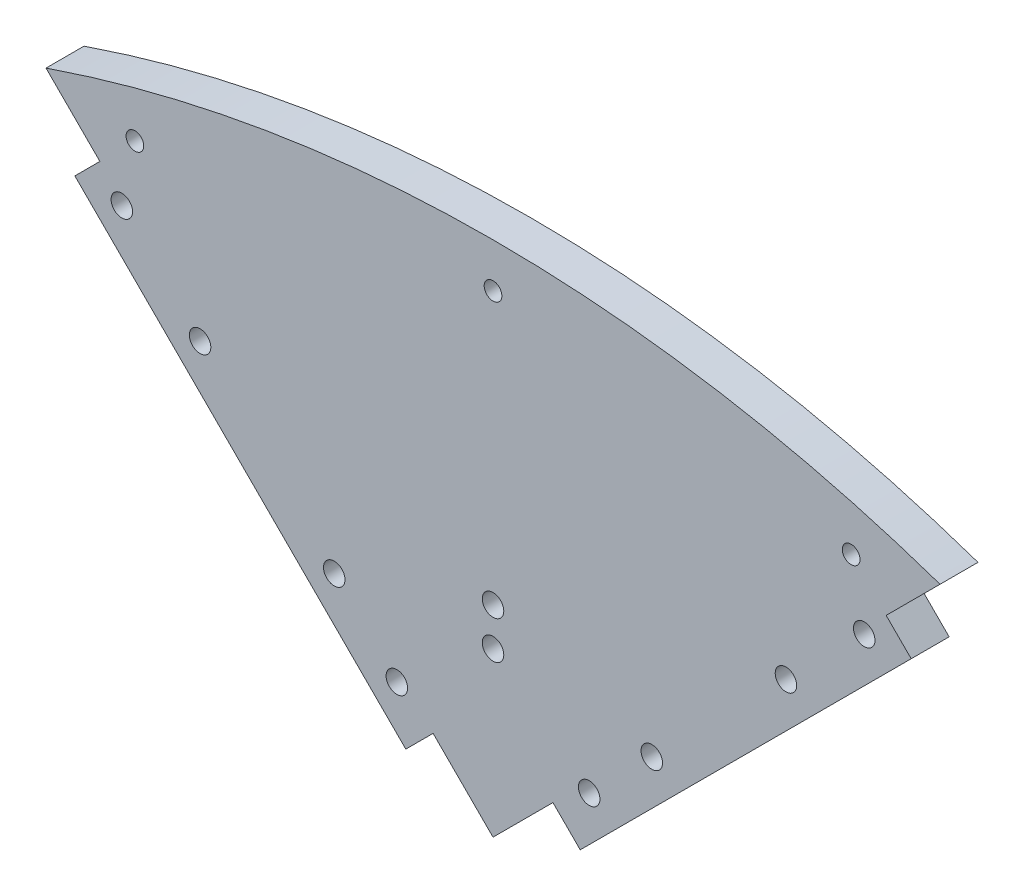
ISO-10303-21;
HEADER;
FILE_DESCRIPTION(('STEP AP214'),'2;1');
FILE_NAME('part.step','',(''),(''),'','','');
FILE_SCHEMA(('AUTOMOTIVE_DESIGN { 1 0 10303 214 1 1 1 1 }'));
ENDSEC;
DATA;
#1=APPLICATION_CONTEXT('core data for automotive mechanical design processes');
#2=APPLICATION_PROTOCOL_DEFINITION('international standard','automotive_design',2000,#1);
#3=PRODUCT_CONTEXT('',#1,'mechanical');
#4=PRODUCT('Part','Part','',(#3));
#5=PRODUCT_RELATED_PRODUCT_CATEGORY('part','',(#4));
#6=PRODUCT_DEFINITION_FORMATION('','',#4);
#7=PRODUCT_DEFINITION_CONTEXT('part definition',#1,'design');
#8=PRODUCT_DEFINITION('design','',#6,#7);
#9=PRODUCT_DEFINITION_SHAPE('','',#8);
#10=(LENGTH_UNIT() NAMED_UNIT(*) SI_UNIT(.MILLI.,.METRE.));
#11=(NAMED_UNIT(*) PLANE_ANGLE_UNIT() SI_UNIT($,.RADIAN.));
#12=(NAMED_UNIT(*) SI_UNIT($,.STERADIAN.) SOLID_ANGLE_UNIT());
#13=UNCERTAINTY_MEASURE_WITH_UNIT(LENGTH_MEASURE(1.E-05),#10,'distance_accuracy_value','');
#14=(GEOMETRIC_REPRESENTATION_CONTEXT(3) GLOBAL_UNCERTAINTY_ASSIGNED_CONTEXT((#13)) GLOBAL_UNIT_ASSIGNED_CONTEXT((#10,
#11,#12)) REPRESENTATION_CONTEXT('',''));
#15=CARTESIAN_POINT('',(0.,0.,0.));
#16=DIRECTION('',(0.,0.,1.));
#17=DIRECTION('',(1.,0.,0.));
#18=AXIS2_PLACEMENT_3D('',#15,#16,#17);
#19=CARTESIAN_POINT('',(0.,0.,67.));
#20=DIRECTION('',(0.,0.,1.));
#21=DIRECTION('',(1.,0.,0.));
#22=AXIS2_PLACEMENT_3D('',#19,#20,#21);
#23=PLANE('',#22);
#24=CARTESIAN_POINT('',(56.620161762074,202.22303845515,67.));
#25=DIRECTION('',(0.,0.,1.));
#26=DIRECTION('',(1.,0.,0.));
#27=AXIS2_PLACEMENT_3D('',#24,#25,#26);
#28=CIRCLE('',#27,1.4);
#29=CARTESIAN_POINT('',(58.020161762074,202.22303845515,67.));
#30=VERTEX_POINT('',#29);
#31=EDGE_CURVE('E9',#30,#30,#28,.T.);
#32=ORIENTED_EDGE('',*,*,#31,.T.);
#33=EDGE_LOOP('',(#32));
#34=FACE_BOUND('',#33,.T.);
#35=CARTESIAN_POINT('',(58.689862838483,192.33304448274,67.));
#36=DIRECTION('',(0.,0.,1.));
#37=DIRECTION('',(-0.707106781186548,-0.707106781186548,0.));
#38=AXIS2_PLACEMENT_3D('',#35,#36,#37);
#39=CIRCLE('',#38,1.7);
#40=CARTESIAN_POINT('',(57.487781310466,191.13096295472,67.));
#41=VERTEX_POINT('',#40);
#42=EDGE_CURVE('E259',#41,#41,#39,.T.);
#43=ORIENTED_EDGE('',*,*,#42,.T.);
#44=EDGE_LOOP('',(#43));
#45=FACE_BOUND('',#44,.T.);
#46=CARTESIAN_POINT('',(46.315494167719,179.95867581197,67.));
#47=DIRECTION('',(0.,0.,1.));
#48=DIRECTION('',(-0.707106781186548,-0.707106781186548,0.));
#49=AXIS2_PLACEMENT_3D('',#46,#47,#48);
#50=CIRCLE('',#49,1.7);
#51=CARTESIAN_POINT('',(45.113412639702,178.75659428395,67.));
#52=VERTEX_POINT('',#51);
#53=EDGE_CURVE('E194',#52,#52,#50,.T.);
#54=ORIENTED_EDGE('',*,*,#53,.T.);
#55=EDGE_LOOP('',(#54));
#56=FACE_BOUND('',#55,.T.);
#57=CARTESIAN_POINT('',(0.,210.,67.));
#58=DIRECTION('',(0.,0.,1.));
#59=DIRECTION('',(1.,0.,0.));
#60=AXIS2_PLACEMENT_3D('',#57,#58,#59);
#61=CIRCLE('',#60,1.4);
#62=CARTESIAN_POINT('',(1.4,210.,67.));
#63=VERTEX_POINT('',#62);
#64=EDGE_CURVE('E180',#63,#63,#61,.T.);
#65=ORIENTED_EDGE('',*,*,#64,.T.);
#66=EDGE_LOOP('',(#65));
#67=FACE_BOUND('',#66,.T.);
#68=CARTESIAN_POINT('',(-56.62016176207,202.22303845515,67.));
#69=DIRECTION('',(0.,0.,1.));
#70=DIRECTION('',(1.,0.,0.));
#71=AXIS2_PLACEMENT_3D('',#68,#69,#70);
#72=CIRCLE('',#71,1.4);
#73=CARTESIAN_POINT('',(-55.22016176207,202.22303845515,67.));
#74=VERTEX_POINT('',#73);
#75=EDGE_CURVE('E196',#74,#74,#72,.T.);
#76=ORIENTED_EDGE('',*,*,#75,.T.);
#77=EDGE_LOOP('',(#76));
#78=FACE_BOUND('',#77,.T.);
#79=CARTESIAN_POINT('',(-58.68986283848,192.33304448274,67.));
#80=DIRECTION('',(0.,0.,1.));
#81=DIRECTION('',(0.707106781186548,-0.707106781186548,0.));
#82=AXIS2_PLACEMENT_3D('',#79,#80,#81);
#83=CIRCLE('',#82,1.7);
#84=CARTESIAN_POINT('',(-57.48778131046,191.13096295472,67.));
#85=VERTEX_POINT('',#84);
#86=EDGE_CURVE('E205',#85,#85,#83,.T.);
#87=ORIENTED_EDGE('',*,*,#86,.T.);
#88=EDGE_LOOP('',(#87));
#89=FACE_BOUND('',#88,.T.);
#90=CARTESIAN_POINT('',(-46.31549416771,179.95867581197,67.));
#91=DIRECTION('',(0.,0.,1.));
#92=DIRECTION('',(0.707106781186548,-0.707106781186548,0.));
#93=AXIS2_PLACEMENT_3D('',#90,#91,#92);
#94=CIRCLE('',#93,1.7);
#95=CARTESIAN_POINT('',(-45.1134126397,178.75659428395,67.));
#96=VERTEX_POINT('',#95);
#97=EDGE_CURVE('E275',#96,#96,#94,.T.);
#98=ORIENTED_EDGE('',*,*,#97,.T.);
#99=EDGE_LOOP('',(#98));
#100=FACE_BOUND('',#99,.T.);
#101=CARTESIAN_POINT('',(25.102290732122,158.74547237638,67.));
#102=DIRECTION('',(0.,0.,1.));
#103=DIRECTION('',(-0.707106781186548,-0.707106781186548,0.));
#104=AXIS2_PLACEMENT_3D('',#101,#102,#103);
#105=CIRCLE('',#104,1.7);
#106=CARTESIAN_POINT('',(23.900209204105,157.54339084836,67.));
#107=VERTEX_POINT('',#106);
#108=EDGE_CURVE('E232',#107,#107,#105,.T.);
#109=ORIENTED_EDGE('',*,*,#108,.T.);
#110=EDGE_LOOP('',(#109));
#111=FACE_BOUND('',#110,.T.);
#112=CARTESIAN_POINT('',(15.202795795511,148.84597743976,67.));
#113=DIRECTION('',(0.,0.,1.));
#114=DIRECTION('',(-0.707106781186548,-0.707106781186548,0.));
#115=AXIS2_PLACEMENT_3D('',#112,#113,#114);
#116=CIRCLE('',#115,1.7);
#117=CARTESIAN_POINT('',(14.000714267494,147.64389591175,67.));
#118=VERTEX_POINT('',#117);
#119=EDGE_CURVE('E233',#118,#118,#116,.T.);
#120=ORIENTED_EDGE('',*,*,#119,.T.);
#121=EDGE_LOOP('',(#120));
#122=FACE_BOUND('',#121,.T.);
#123=CARTESIAN_POINT('',(0.,167.,67.));
#124=DIRECTION('',(0.,0.,1.));
#125=DIRECTION('',(1.,0.,0.));
#126=AXIS2_PLACEMENT_3D('',#123,#124,#125);
#127=CIRCLE('',#126,1.7);
#128=CARTESIAN_POINT('',(1.7,167.,67.));
#129=VERTEX_POINT('',#128);
#130=EDGE_CURVE('E341',#129,#129,#127,.T.);
#131=ORIENTED_EDGE('',*,*,#130,.T.);
#132=EDGE_LOOP('',(#131));
#133=FACE_BOUND('',#132,.T.);
#134=CARTESIAN_POINT('',(0.,161.,67.));
#135=DIRECTION('',(0.,0.,1.));
#136=DIRECTION('',(1.,0.,0.));
#137=AXIS2_PLACEMENT_3D('',#134,#135,#136);
#138=CIRCLE('',#137,1.7);
#139=CARTESIAN_POINT('',(1.7,161.,67.));
#140=VERTEX_POINT('',#139);
#141=EDGE_CURVE('E372',#140,#140,#138,.T.);
#142=ORIENTED_EDGE('',*,*,#141,.T.);
#143=EDGE_LOOP('',(#142));
#144=FACE_BOUND('',#143,.T.);
#145=CARTESIAN_POINT('',(-25.10229073212,158.74547237638,67.));
#146=DIRECTION('',(0.,0.,1.));
#147=DIRECTION('',(0.707106781186548,-0.707106781186548,0.));
#148=AXIS2_PLACEMENT_3D('',#145,#146,#147);
#149=CIRCLE('',#148,1.7);
#150=CARTESIAN_POINT('',(-23.9002092041,157.54339084836,67.));
#151=VERTEX_POINT('',#150);
#152=EDGE_CURVE('E306',#151,#151,#149,.T.);
#153=ORIENTED_EDGE('',*,*,#152,.T.);
#154=EDGE_LOOP('',(#153));
#155=FACE_BOUND('',#154,.T.);
#156=CARTESIAN_POINT('',(-15.20279579551,148.84597743976,67.));
#157=DIRECTION('',(0.,0.,1.));
#158=DIRECTION('',(0.707106781186548,-0.707106781186548,0.));
#159=AXIS2_PLACEMENT_3D('',#156,#157,#158);
#160=CIRCLE('',#159,1.7);
#161=CARTESIAN_POINT('',(-14.00071426749,147.64389591175,67.));
#162=VERTEX_POINT('',#161);
#163=EDGE_CURVE('E360',#162,#162,#160,.T.);
#164=ORIENTED_EDGE('',*,*,#163,.T.);
#165=EDGE_LOOP('',(#164));
#166=FACE_BOUND('',#165,.T.);
#167=DIRECTION('',(0.707106781186548,0.707106781186548,0.));
#168=VECTOR('',#167,1.);
#169=CARTESIAN_POINT('',(1.803122292026,136.2948320737,67.));
#170=LINE('',#169,#168);
#171=CARTESIAN_POINT('',(62.154686066298,196.64639584797,67.));
#172=VERTEX_POINT('',#171);
#173=CARTESIAN_POINT('',(70.676206433662,205.16791621534,67.));
#174=VERTEX_POINT('',#173);
#175=EDGE_CURVE('E269',#172,#174,#170,.T.);
#176=ORIENTED_EDGE('',*,*,#175,.F.);
#177=DIRECTION('',(0.707106781186548,-0.707106781186548,0.));
#178=VECTOR('',#177,1.);
#179=CARTESIAN_POINT('',(95.777613511718,163.02346840255,67.));
#180=LINE('',#179,#178);
#181=CARTESIAN_POINT('',(66.114484040942,192.68659787333,67.));
#182=VERTEX_POINT('',#181);
#183=EDGE_CURVE('E220',#172,#182,#180,.T.);
#184=ORIENTED_EDGE('',*,*,#183,.T.);
#185=DIRECTION('',(0.707106781186548,0.707106781186548,0.));
#186=VECTOR('',#185,1.);
#187=CARTESIAN_POINT('',(1.414213562373,127.98632739476,67.));
#188=LINE('',#187,#186);
#189=CARTESIAN_POINT('',(13.788582233138,140.36069606553,67.));
#190=VERTEX_POINT('',#189);
#191=EDGE_CURVE('E208',#190,#182,#188,.T.);
#192=ORIENTED_EDGE('',*,*,#191,.F.);
#193=DIRECTION('',(0.707106781186548,-0.707106781186548,0.));
#194=VECTOR('',#193,1.);
#195=CARTESIAN_POINT('',(43.274935008617,110.87434329005,67.));
#196=LINE('',#195,#194);
#197=CARTESIAN_POINT('',(9.4752308679,144.67404743076,67.));
#198=VERTEX_POINT('',#197);
#199=EDGE_CURVE('E165',#198,#190,#196,.T.);
#200=ORIENTED_EDGE('',*,*,#199,.F.);
#201=DIRECTION('',(0.707106781186548,0.707106781186548,0.));
#202=VECTOR('',#201,1.);
#203=CARTESIAN_POINT('',(-29.06208870676,106.1367278561,67.));
#204=LINE('',#203,#202);
#205=CARTESIAN_POINT('',(0.,135.19881656286,67.));
#206=VERTEX_POINT('',#205);
#207=EDGE_CURVE('E249',#206,#198,#204,.T.);
#208=ORIENTED_EDGE('',*,*,#207,.F.);
#209=DIRECTION('',(-0.707106781186548,0.707106781186548,0.));
#210=VECTOR('',#209,1.);
#211=CARTESIAN_POINT('',(29.062088706767,106.1367278561,67.));
#212=LINE('',#211,#210);
#213=CARTESIAN_POINT('',(-9.4752308679,144.67404743076,67.));
#214=VERTEX_POINT('',#213);
#215=EDGE_CURVE('E399',#206,#214,#212,.T.);
#216=ORIENTED_EDGE('',*,*,#215,.T.);
#217=DIRECTION('',(0.707106781186548,0.707106781186548,0.));
#218=VECTOR('',#217,1.);
#219=CARTESIAN_POINT('',(-53.74011537017,100.40916292849,67.));
#220=LINE('',#219,#218);
#221=CARTESIAN_POINT('',(-13.78858223313,140.36069606553,67.));
#222=VERTEX_POINT('',#221);
#223=EDGE_CURVE('E270',#222,#214,#220,.T.);
#224=ORIENTED_EDGE('',*,*,#223,.F.);
#225=DIRECTION('',(-0.707106781186548,0.707106781186548,0.));
#226=VECTOR('',#225,1.);
#227=CARTESIAN_POINT('',(-1.414213562373,127.98632739476,67.));
#228=LINE('',#227,#226);
#229=CARTESIAN_POINT('',(-66.11448404094,192.68659787333,67.));
#230=VERTEX_POINT('',#229);
#231=EDGE_CURVE('E150',#222,#230,#228,.T.);
#232=ORIENTED_EDGE('',*,*,#231,.T.);
#233=DIRECTION('',(0.707106781186548,0.707106781186548,0.));
#234=VECTOR('',#233,1.);
#235=CARTESIAN_POINT('',(-101.4698231002,157.331258814,67.));
#236=LINE('',#235,#234);
#237=CARTESIAN_POINT('',(-62.15468606629,196.64639584797,67.));
#238=VERTEX_POINT('',#237);
#239=EDGE_CURVE('E216',#230,#238,#236,.T.);
#240=ORIENTED_EDGE('',*,*,#239,.T.);
#241=DIRECTION('',(-0.707106781186548,0.707106781186548,0.));
#242=VECTOR('',#241,1.);
#243=CARTESIAN_POINT('',(-1.803122292026,136.2948320737,67.));
#244=LINE('',#243,#242);
#245=CARTESIAN_POINT('',(-70.67620643366,205.16791621534,67.));
#246=VERTEX_POINT('',#245);
#247=EDGE_CURVE('E237',#238,#246,#244,.T.);
#248=ORIENTED_EDGE('',*,*,#247,.T.);
#249=CARTESIAN_POINT('',(0.,0.,67.));
#250=DIRECTION('',(0.,0.,-1.));
#251=DIRECTION('',(-0.959406277217956,0.282027649769987,0.));
#252=AXIS2_PLACEMENT_3D('',#249,#250,#251);
#253=CIRCLE('',#252,217.);
#254=EDGE_CURVE('E298',#246,#174,#253,.T.);
#255=ORIENTED_EDGE('',*,*,#254,.T.);
#256=EDGE_LOOP('',(#176,#184,#192,#200,#208,#216,#224,#232,#240,#248,#255));
#257=FACE_BOUND('',#256,.T.);
#258=ADVANCED_FACE('F14',(#34,#45,#56,#67,#78,#89,#100,#111,#122,#133,#144,#155,#166,#257),#23,.F.);
#259=CARTESIAN_POINT('',(56.620161762074,202.22303845515,66.89));
#260=DIRECTION('',(0.,0.,1.));
#261=DIRECTION('',(1.,0.,0.));
#262=AXIS2_PLACEMENT_3D('',#259,#260,#261);
#263=CYLINDRICAL_SURFACE('',#262,1.4);
#264=DIRECTION('',(0.,0.,1.));
#265=VECTOR('',#264,1.);
#266=CARTESIAN_POINT('',(58.020161762074,202.22303845515,66.89));
#267=LINE('',#266,#265);
#268=CARTESIAN_POINT('',(58.020161762074,202.22303845515,73.));
#269=VERTEX_POINT('',#268);
#270=EDGE_CURVE('E25',#30,#269,#267,.T.);
#271=ORIENTED_EDGE('',*,*,#270,.F.);
#272=ORIENTED_EDGE('',*,*,#31,.F.);
#273=ORIENTED_EDGE('',*,*,#270,.T.);
#274=CARTESIAN_POINT('',(56.620161762074,202.22303845515,73.));
#275=DIRECTION('',(0.,0.,1.));
#276=DIRECTION('',(1.,0.,0.));
#277=AXIS2_PLACEMENT_3D('',#274,#275,#276);
#278=CIRCLE('',#277,1.4);
#279=EDGE_CURVE('E317',#269,#269,#278,.T.);
#280=ORIENTED_EDGE('',*,*,#279,.T.);
#281=EDGE_LOOP('',(#271,#272,#273,#280));
#282=FACE_BOUND('',#281,.T.);
#283=ADVANCED_FACE('F515',(#282),#263,.F.);
#284=CARTESIAN_POINT('',(58.689862838483,192.33304448274,60.));
#285=DIRECTION('',(0.,0.,1.));
#286=DIRECTION('',(-0.707106781186548,-0.707106781186548,0.));
#287=AXIS2_PLACEMENT_3D('',#284,#285,#286);
#288=CYLINDRICAL_SURFACE('',#287,1.7);
#289=DIRECTION('',(0.,0.,1.));
#290=VECTOR('',#289,1.);
#291=CARTESIAN_POINT('',(57.487781310466,191.13096295472,60.));
#292=LINE('',#291,#290);
#293=CARTESIAN_POINT('',(57.487781310466,191.13096295472,73.));
#294=VERTEX_POINT('',#293);
#295=EDGE_CURVE('E252',#41,#294,#292,.T.);
#296=ORIENTED_EDGE('',*,*,#295,.F.);
#297=ORIENTED_EDGE('',*,*,#42,.F.);
#298=ORIENTED_EDGE('',*,*,#295,.T.);
#299=CARTESIAN_POINT('',(58.689862838483,192.33304448274,73.));
#300=DIRECTION('',(0.,0.,1.));
#301=DIRECTION('',(-0.707106781186548,-0.707106781186548,0.));
#302=AXIS2_PLACEMENT_3D('',#299,#300,#301);
#303=CIRCLE('',#302,1.7);
#304=EDGE_CURVE('E321',#294,#294,#303,.T.);
#305=ORIENTED_EDGE('',*,*,#304,.T.);
#306=EDGE_LOOP('',(#296,#297,#298,#305));
#307=FACE_BOUND('',#306,.T.);
#308=ADVANCED_FACE('F521',(#307),#288,.F.);
#309=CARTESIAN_POINT('',(46.315494167719,179.95867581197,60.));
#310=DIRECTION('',(0.,0.,1.));
#311=DIRECTION('',(-0.707106781186548,-0.707106781186548,0.));
#312=AXIS2_PLACEMENT_3D('',#309,#310,#311);
#313=CYLINDRICAL_SURFACE('',#312,1.7);
#314=DIRECTION('',(0.,0.,1.));
#315=VECTOR('',#314,1.);
#316=CARTESIAN_POINT('',(45.113412639702,178.75659428395,60.));
#317=LINE('',#316,#315);
#318=CARTESIAN_POINT('',(45.113412639702,178.75659428395,73.));
#319=VERTEX_POINT('',#318);
#320=EDGE_CURVE('E185',#52,#319,#317,.T.);
#321=ORIENTED_EDGE('',*,*,#320,.F.);
#322=ORIENTED_EDGE('',*,*,#53,.F.);
#323=ORIENTED_EDGE('',*,*,#320,.T.);
#324=CARTESIAN_POINT('',(46.315494167719,179.95867581197,73.));
#325=DIRECTION('',(0.,0.,1.));
#326=DIRECTION('',(-0.707106781186548,-0.707106781186548,0.));
#327=AXIS2_PLACEMENT_3D('',#324,#325,#326);
#328=CIRCLE('',#327,1.7);
#329=EDGE_CURVE('E364',#319,#319,#328,.T.);
#330=ORIENTED_EDGE('',*,*,#329,.T.);
#331=EDGE_LOOP('',(#321,#322,#323,#330));
#332=FACE_BOUND('',#331,.T.);
#333=ADVANCED_FACE('F511',(#332),#313,.F.);
#334=CARTESIAN_POINT('',(0.,210.,66.89));
#335=DIRECTION('',(0.,0.,1.));
#336=DIRECTION('',(1.,0.,0.));
#337=AXIS2_PLACEMENT_3D('',#334,#335,#336);
#338=CYLINDRICAL_SURFACE('',#337,1.4);
#339=DIRECTION('',(0.,0.,1.));
#340=VECTOR('',#339,1.);
#341=CARTESIAN_POINT('',(1.4,210.,66.89));
#342=LINE('',#341,#340);
#343=CARTESIAN_POINT('',(1.4,210.,73.));
#344=VERTEX_POINT('',#343);
#345=EDGE_CURVE('E186',#63,#344,#342,.T.);
#346=ORIENTED_EDGE('',*,*,#345,.F.);
#347=ORIENTED_EDGE('',*,*,#64,.F.);
#348=ORIENTED_EDGE('',*,*,#345,.T.);
#349=CARTESIAN_POINT('',(0.,210.,73.));
#350=DIRECTION('',(0.,0.,1.));
#351=DIRECTION('',(1.,0.,0.));
#352=AXIS2_PLACEMENT_3D('',#349,#350,#351);
#353=CIRCLE('',#352,1.4);
#354=EDGE_CURVE('E225',#344,#344,#353,.T.);
#355=ORIENTED_EDGE('',*,*,#354,.T.);
#356=EDGE_LOOP('',(#346,#347,#348,#355));
#357=FACE_BOUND('',#356,.T.);
#358=ADVANCED_FACE('F540',(#357),#338,.F.);
#359=CARTESIAN_POINT('',(-56.62016176207,202.22303845515,66.89));
#360=DIRECTION('',(0.,0.,1.));
#361=DIRECTION('',(1.,0.,0.));
#362=AXIS2_PLACEMENT_3D('',#359,#360,#361);
#363=CYLINDRICAL_SURFACE('',#362,1.4);
#364=DIRECTION('',(0.,0.,1.));
#365=VECTOR('',#364,1.);
#366=CARTESIAN_POINT('',(-55.22016176207,202.22303845515,66.89));
#367=LINE('',#366,#365);
#368=CARTESIAN_POINT('',(-55.22016176207,202.22303845515,73.));
#369=VERTEX_POINT('',#368);
#370=EDGE_CURVE('E201',#74,#369,#367,.T.);
#371=ORIENTED_EDGE('',*,*,#370,.F.);
#372=ORIENTED_EDGE('',*,*,#75,.F.);
#373=ORIENTED_EDGE('',*,*,#370,.T.);
#374=CARTESIAN_POINT('',(-56.62016176207,202.22303845515,73.));
#375=DIRECTION('',(0.,0.,1.));
#376=DIRECTION('',(1.,0.,0.));
#377=AXIS2_PLACEMENT_3D('',#374,#375,#376);
#378=CIRCLE('',#377,1.4);
#379=EDGE_CURVE('E222',#369,#369,#378,.T.);
#380=ORIENTED_EDGE('',*,*,#379,.T.);
#381=EDGE_LOOP('',(#371,#372,#373,#380));
#382=FACE_BOUND('',#381,.T.);
#383=ADVANCED_FACE('F543',(#382),#363,.F.);
#384=CARTESIAN_POINT('',(-58.68986283848,192.33304448274,60.));
#385=DIRECTION('',(0.,0.,1.));
#386=DIRECTION('',(0.707106781186548,-0.707106781186548,0.));
#387=AXIS2_PLACEMENT_3D('',#384,#385,#386);
#388=CYLINDRICAL_SURFACE('',#387,1.7);
#389=DIRECTION('',(0.,0.,1.));
#390=VECTOR('',#389,1.);
#391=CARTESIAN_POINT('',(-57.48778131046,191.13096295472,60.));
#392=LINE('',#391,#390);
#393=CARTESIAN_POINT('',(-57.48778131046,191.13096295472,73.));
#394=VERTEX_POINT('',#393);
#395=EDGE_CURVE('E297',#85,#394,#392,.T.);
#396=ORIENTED_EDGE('',*,*,#395,.F.);
#397=ORIENTED_EDGE('',*,*,#86,.F.);
#398=ORIENTED_EDGE('',*,*,#395,.T.);
#399=CARTESIAN_POINT('',(-58.68986283848,192.33304448274,73.));
#400=DIRECTION('',(0.,0.,1.));
#401=DIRECTION('',(0.707106781186548,-0.707106781186548,0.));
#402=AXIS2_PLACEMENT_3D('',#399,#400,#401);
#403=CIRCLE('',#402,1.7);
#404=EDGE_CURVE('E226',#394,#394,#403,.T.);
#405=ORIENTED_EDGE('',*,*,#404,.T.);
#406=EDGE_LOOP('',(#396,#397,#398,#405));
#407=FACE_BOUND('',#406,.T.);
#408=ADVANCED_FACE('F532',(#407),#388,.F.);
#409=CARTESIAN_POINT('',(-46.31549416771,179.95867581197,60.));
#410=DIRECTION('',(0.,0.,1.));
#411=DIRECTION('',(0.707106781186548,-0.707106781186548,0.));
#412=AXIS2_PLACEMENT_3D('',#409,#410,#411);
#413=CYLINDRICAL_SURFACE('',#412,1.7);
#414=DIRECTION('',(0.,0.,1.));
#415=VECTOR('',#414,1.);
#416=CARTESIAN_POINT('',(-45.1134126397,178.75659428395,60.));
#417=LINE('',#416,#415);
#418=CARTESIAN_POINT('',(-45.1134126397,178.75659428395,73.));
#419=VERTEX_POINT('',#418);
#420=EDGE_CURVE('E258',#96,#419,#417,.T.);
#421=ORIENTED_EDGE('',*,*,#420,.F.);
#422=ORIENTED_EDGE('',*,*,#97,.F.);
#423=ORIENTED_EDGE('',*,*,#420,.T.);
#424=CARTESIAN_POINT('',(-46.31549416771,179.95867581197,73.));
#425=DIRECTION('',(0.,0.,1.));
#426=DIRECTION('',(0.707106781186548,-0.707106781186548,0.));
#427=AXIS2_PLACEMENT_3D('',#424,#425,#426);
#428=CIRCLE('',#427,1.7);
#429=EDGE_CURVE('E284',#419,#419,#428,.T.);
#430=ORIENTED_EDGE('',*,*,#429,.T.);
#431=EDGE_LOOP('',(#421,#422,#423,#430));
#432=FACE_BOUND('',#431,.T.);
#433=ADVANCED_FACE('F528',(#432),#413,.F.);
#434=CARTESIAN_POINT('',(25.102290732122,158.74547237638,60.));
#435=DIRECTION('',(0.,0.,1.));
#436=DIRECTION('',(-0.707106781186548,-0.707106781186548,0.));
#437=AXIS2_PLACEMENT_3D('',#434,#435,#436);
#438=CYLINDRICAL_SURFACE('',#437,1.7);
#439=DIRECTION('',(0.,0.,1.));
#440=VECTOR('',#439,1.);
#441=CARTESIAN_POINT('',(23.900209204105,157.54339084836,60.));
#442=LINE('',#441,#440);
#443=CARTESIAN_POINT('',(23.900209204105,157.54339084836,73.));
#444=VERTEX_POINT('',#443);
#445=EDGE_CURVE('E228',#107,#444,#442,.T.);
#446=ORIENTED_EDGE('',*,*,#445,.F.);
#447=ORIENTED_EDGE('',*,*,#108,.F.);
#448=ORIENTED_EDGE('',*,*,#445,.T.);
#449=CARTESIAN_POINT('',(25.102290732122,158.74547237638,73.));
#450=DIRECTION('',(0.,0.,1.));
#451=DIRECTION('',(-0.707106781186548,-0.707106781186548,0.));
#452=AXIS2_PLACEMENT_3D('',#449,#450,#451);
#453=CIRCLE('',#452,1.7);
#454=EDGE_CURVE('E283',#444,#444,#453,.T.);
#455=ORIENTED_EDGE('',*,*,#454,.T.);
#456=EDGE_LOOP('',(#446,#447,#448,#455));
#457=FACE_BOUND('',#456,.T.);
#458=ADVANCED_FACE('F531',(#457),#438,.F.);
#459=CARTESIAN_POINT('',(15.202795795511,148.84597743976,60.));
#460=DIRECTION('',(0.,0.,1.));
#461=DIRECTION('',(-0.707106781186548,-0.707106781186548,0.));
#462=AXIS2_PLACEMENT_3D('',#459,#460,#461);
#463=CYLINDRICAL_SURFACE('',#462,1.7);
#464=DIRECTION('',(0.,0.,1.));
#465=VECTOR('',#464,1.);
#466=CARTESIAN_POINT('',(14.000714267494,147.64389591175,60.));
#467=LINE('',#466,#465);
#468=CARTESIAN_POINT('',(14.000714267494,147.64389591175,73.));
#469=VERTEX_POINT('',#468);
#470=EDGE_CURVE('E265',#118,#469,#467,.T.);
#471=ORIENTED_EDGE('',*,*,#470,.F.);
#472=ORIENTED_EDGE('',*,*,#119,.F.);
#473=ORIENTED_EDGE('',*,*,#470,.T.);
#474=CARTESIAN_POINT('',(15.202795795511,148.84597743976,73.));
#475=DIRECTION('',(0.,0.,1.));
#476=DIRECTION('',(-0.707106781186548,-0.707106781186548,0.));
#477=AXIS2_PLACEMENT_3D('',#474,#475,#476);
#478=CIRCLE('',#477,1.7);
#479=EDGE_CURVE('E214',#469,#469,#478,.T.);
#480=ORIENTED_EDGE('',*,*,#479,.T.);
#481=EDGE_LOOP('',(#471,#472,#473,#480));
#482=FACE_BOUND('',#481,.T.);
#483=ADVANCED_FACE('F494',(#482),#463,.F.);
#484=CARTESIAN_POINT('',(0.,167.,60.));
#485=DIRECTION('',(0.,0.,1.));
#486=DIRECTION('',(1.,0.,0.));
#487=AXIS2_PLACEMENT_3D('',#484,#485,#486);
#488=CYLINDRICAL_SURFACE('',#487,1.7);
#489=DIRECTION('',(0.,0.,1.));
#490=VECTOR('',#489,1.);
#491=CARTESIAN_POINT('',(1.7,167.,60.));
#492=LINE('',#491,#490);
#493=CARTESIAN_POINT('',(1.7,167.,73.));
#494=VERTEX_POINT('',#493);
#495=EDGE_CURVE('E345',#129,#494,#492,.T.);
#496=ORIENTED_EDGE('',*,*,#495,.F.);
#497=ORIENTED_EDGE('',*,*,#130,.F.);
#498=ORIENTED_EDGE('',*,*,#495,.T.);
#499=CARTESIAN_POINT('',(0.,167.,73.));
#500=DIRECTION('',(0.,0.,1.));
#501=DIRECTION('',(1.,0.,0.));
#502=AXIS2_PLACEMENT_3D('',#499,#500,#501);
#503=CIRCLE('',#502,1.7);
#504=EDGE_CURVE('E210',#494,#494,#503,.T.);
#505=ORIENTED_EDGE('',*,*,#504,.T.);
#506=EDGE_LOOP('',(#496,#497,#498,#505));
#507=FACE_BOUND('',#506,.T.);
#508=ADVANCED_FACE('F565',(#507),#488,.F.);
#509=CARTESIAN_POINT('',(0.,161.,60.));
#510=DIRECTION('',(0.,0.,1.));
#511=DIRECTION('',(1.,0.,0.));
#512=AXIS2_PLACEMENT_3D('',#509,#510,#511);
#513=CYLINDRICAL_SURFACE('',#512,1.7);
#514=DIRECTION('',(0.,0.,1.));
#515=VECTOR('',#514,1.);
#516=CARTESIAN_POINT('',(1.7,161.,60.));
#517=LINE('',#516,#515);
#518=CARTESIAN_POINT('',(1.7,161.,73.));
#519=VERTEX_POINT('',#518);
#520=EDGE_CURVE('E309',#140,#519,#517,.T.);
#521=ORIENTED_EDGE('',*,*,#520,.F.);
#522=ORIENTED_EDGE('',*,*,#141,.F.);
#523=ORIENTED_EDGE('',*,*,#520,.T.);
#524=CARTESIAN_POINT('',(0.,161.,73.));
#525=DIRECTION('',(0.,0.,1.));
#526=DIRECTION('',(1.,0.,0.));
#527=AXIS2_PLACEMENT_3D('',#524,#525,#526);
#528=CIRCLE('',#527,1.7);
#529=EDGE_CURVE('E215',#519,#519,#528,.T.);
#530=ORIENTED_EDGE('',*,*,#529,.T.);
#531=EDGE_LOOP('',(#521,#522,#523,#530));
#532=FACE_BOUND('',#531,.T.);
#533=ADVANCED_FACE('F645',(#532),#513,.F.);
#534=CARTESIAN_POINT('',(-25.10229073212,158.74547237638,60.));
#535=DIRECTION('',(0.,0.,1.));
#536=DIRECTION('',(0.707106781186548,-0.707106781186548,0.));
#537=AXIS2_PLACEMENT_3D('',#534,#535,#536);
#538=CYLINDRICAL_SURFACE('',#537,1.7);
#539=DIRECTION('',(0.,0.,1.));
#540=VECTOR('',#539,1.);
#541=CARTESIAN_POINT('',(-23.9002092041,157.54339084836,60.));
#542=LINE('',#541,#540);
#543=CARTESIAN_POINT('',(-23.9002092041,157.54339084836,73.));
#544=VERTEX_POINT('',#543);
#545=EDGE_CURVE('E310',#151,#544,#542,.T.);
#546=ORIENTED_EDGE('',*,*,#545,.F.);
#547=ORIENTED_EDGE('',*,*,#152,.F.);
#548=ORIENTED_EDGE('',*,*,#545,.T.);
#549=CARTESIAN_POINT('',(-25.10229073212,158.74547237638,73.));
#550=DIRECTION('',(0.,0.,1.));
#551=DIRECTION('',(0.707106781186548,-0.707106781186548,0.));
#552=AXIS2_PLACEMENT_3D('',#549,#550,#551);
#553=CIRCLE('',#552,1.7);
#554=EDGE_CURVE('E18',#544,#544,#553,.T.);
#555=ORIENTED_EDGE('',*,*,#554,.T.);
#556=EDGE_LOOP('',(#546,#547,#548,#555));
#557=FACE_BOUND('',#556,.T.);
#558=ADVANCED_FACE('F643',(#557),#538,.F.);
#559=CARTESIAN_POINT('',(-15.20279579551,148.84597743976,60.));
#560=DIRECTION('',(0.,0.,1.));
#561=DIRECTION('',(0.707106781186548,-0.707106781186548,0.));
#562=AXIS2_PLACEMENT_3D('',#559,#560,#561);
#563=CYLINDRICAL_SURFACE('',#562,1.7);
#564=DIRECTION('',(0.,0.,1.));
#565=VECTOR('',#564,1.);
#566=CARTESIAN_POINT('',(-14.00071426749,147.64389591175,60.));
#567=LINE('',#566,#565);
#568=CARTESIAN_POINT('',(-14.00071426749,147.64389591175,73.));
#569=VERTEX_POINT('',#568);
#570=EDGE_CURVE('E300',#162,#569,#567,.T.);
#571=ORIENTED_EDGE('',*,*,#570,.F.);
#572=ORIENTED_EDGE('',*,*,#163,.F.);
#573=ORIENTED_EDGE('',*,*,#570,.T.);
#574=CARTESIAN_POINT('',(-15.20279579551,148.84597743976,73.));
#575=DIRECTION('',(0.,0.,1.));
#576=DIRECTION('',(0.707106781186548,-0.707106781186548,0.));
#577=AXIS2_PLACEMENT_3D('',#574,#575,#576);
#578=CIRCLE('',#577,1.7);
#579=EDGE_CURVE('E393',#569,#569,#578,.T.);
#580=ORIENTED_EDGE('',*,*,#579,.T.);
#581=EDGE_LOOP('',(#571,#572,#573,#580));
#582=FACE_BOUND('',#581,.T.);
#583=ADVANCED_FACE('F554',(#582),#563,.F.);
#584=CARTESIAN_POINT('',(0.,0.,67.));
#585=DIRECTION('',(0.,0.,1.));
#586=DIRECTION('',(1.,0.,0.));
#587=AXIS2_PLACEMENT_3D('',#584,#585,#586);
#588=CYLINDRICAL_SURFACE('',#587,217.);
#589=CARTESIAN_POINT('',(0.,0.,73.));
#590=DIRECTION('',(0.,0.,1.));
#591=DIRECTION('',(-0.959406277217956,-0.282027649769987,0.));
#592=AXIS2_PLACEMENT_3D('',#589,#590,#591);
#593=CIRCLE('',#592,217.);
#594=CARTESIAN_POINT('',(70.676206433663,205.16791621534,73.));
#595=VERTEX_POINT('',#594);
#596=CARTESIAN_POINT('',(-70.67620643366,205.16791621534,73.));
#597=VERTEX_POINT('',#596);
#598=EDGE_CURVE('E337',#595,#597,#593,.T.);
#599=ORIENTED_EDGE('',*,*,#598,.F.);
#600=DIRECTION('',(0.,0.,1.));
#601=VECTOR('',#600,1.);
#602=CARTESIAN_POINT('',(70.676206433662,205.16791621534,67.));
#603=LINE('',#602,#601);
#604=EDGE_CURVE('E200',#174,#595,#603,.T.);
#605=ORIENTED_EDGE('',*,*,#604,.F.);
#606=ORIENTED_EDGE('',*,*,#254,.F.);
#607=DIRECTION('',(0.,0.,1.));
#608=VECTOR('',#607,1.);
#609=CARTESIAN_POINT('',(-70.67620643366,205.16791621534,67.));
#610=LINE('',#609,#608);
#611=EDGE_CURVE('E234',#246,#597,#610,.T.);
#612=ORIENTED_EDGE('',*,*,#611,.T.);
#613=EDGE_LOOP('',(#599,#605,#606,#612));
#614=FACE_BOUND('',#613,.T.);
#615=ADVANCED_FACE('F551',(#614),#588,.T.);
#616=CARTESIAN_POINT('',(70.852099474892,205.34380925657,60.));
#617=DIRECTION('',(0.707106781186548,-0.707106781186548,0.));
#618=DIRECTION('',(0.,0.,-1.));
#619=AXIS2_PLACEMENT_3D('',#616,#617,#618);
#620=PLANE('',#619);
#621=DIRECTION('',(0.,0.,1.));
#622=VECTOR('',#621,1.);
#623=CARTESIAN_POINT('',(62.154686066298,196.64639584797,60.));
#624=LINE('',#623,#622);
#625=CARTESIAN_POINT('',(62.154686066298,196.64639584797,73.));
#626=VERTEX_POINT('',#625);
#627=EDGE_CURVE('E238',#172,#626,#624,.T.);
#628=ORIENTED_EDGE('',*,*,#627,.F.);
#629=ORIENTED_EDGE('',*,*,#175,.T.);
#630=ORIENTED_EDGE('',*,*,#604,.T.);
#631=DIRECTION('',(0.707106781186548,0.707106781186548,0.));
#632=VECTOR('',#631,1.);
#633=CARTESIAN_POINT('',(1.803122292026,136.2948320737,73.));
#634=LINE('',#633,#632);
#635=EDGE_CURVE('E332',#626,#595,#634,.T.);
#636=ORIENTED_EDGE('',*,*,#635,.F.);
#637=EDGE_LOOP('',(#628,#629,#630,#636));
#638=FACE_BOUND('',#637,.T.);
#639=ADVANCED_FACE('F446',(#638),#620,.T.);
#640=CARTESIAN_POINT('',(-70.85209947489,205.34380925657,60.));
#641=DIRECTION('',(0.707106781186548,0.707106781186548,0.));
#642=DIRECTION('',(0.,0.,-1.));
#643=AXIS2_PLACEMENT_3D('',#640,#641,#642);
#644=PLANE('',#643);
#645=DIRECTION('',(-0.707106781186548,0.707106781186548,0.));
#646=VECTOR('',#645,1.);
#647=CARTESIAN_POINT('',(-1.803122292026,136.2948320737,73.));
#648=LINE('',#647,#646);
#649=CARTESIAN_POINT('',(-62.15468606629,196.64639584797,73.));
#650=VERTEX_POINT('',#649);
#651=EDGE_CURVE('E279',#650,#597,#648,.T.);
#652=ORIENTED_EDGE('',*,*,#651,.T.);
#653=ORIENTED_EDGE('',*,*,#611,.F.);
#654=ORIENTED_EDGE('',*,*,#247,.F.);
#655=DIRECTION('',(0.,0.,1.));
#656=VECTOR('',#655,1.);
#657=CARTESIAN_POINT('',(-62.15468606629,196.64639584797,60.));
#658=LINE('',#657,#656);
#659=EDGE_CURVE('E221',#238,#650,#658,.T.);
#660=ORIENTED_EDGE('',*,*,#659,.T.);
#661=EDGE_LOOP('',(#652,#653,#654,#660));
#662=FACE_BOUND('',#661,.T.);
#663=ADVANCED_FACE('F16',(#662),#644,.F.);
#664=CARTESIAN_POINT('',(62.154686066298,196.64639584797,60.));
#665=DIRECTION('',(-0.707106781186548,-0.707106781186548,0.));
#666=DIRECTION('',(-0.707106781186548,0.707106781186548,0.));
#667=AXIS2_PLACEMENT_3D('',#664,#665,#666);
#668=PLANE('',#667);
#669=DIRECTION('',(0.,0.,1.));
#670=VECTOR('',#669,1.);
#671=CARTESIAN_POINT('',(66.114484040942,192.68659787333,60.));
#672=LINE('',#671,#670);
#673=CARTESIAN_POINT('',(66.114484040942,192.68659787333,73.));
#674=VERTEX_POINT('',#673);
#675=EDGE_CURVE('E383',#182,#674,#672,.T.);
#676=ORIENTED_EDGE('',*,*,#675,.F.);
#677=ORIENTED_EDGE('',*,*,#183,.F.);
#678=ORIENTED_EDGE('',*,*,#627,.T.);
#679=DIRECTION('',(0.707106781186548,-0.707106781186548,0.));
#680=VECTOR('',#679,1.);
#681=CARTESIAN_POINT('',(95.777613511718,163.02346840255,73.));
#682=LINE('',#681,#680);
#683=EDGE_CURVE('E328',#626,#674,#682,.T.);
#684=ORIENTED_EDGE('',*,*,#683,.T.);
#685=EDGE_LOOP('',(#676,#677,#678,#684));
#686=FACE_BOUND('',#685,.T.);
#687=ADVANCED_FACE('F443',(#686),#668,.F.);
#688=CARTESIAN_POINT('',(-73.5391052434,185.26197667087,60.));
#689=DIRECTION('',(0.707106781186548,-0.707106781186548,0.));
#690=DIRECTION('',(0.,0.,-1.));
#691=AXIS2_PLACEMENT_3D('',#688,#689,#690);
#692=PLANE('',#691);
#693=DIRECTION('',(0.707106781186548,0.707106781186548,0.));
#694=VECTOR('',#693,1.);
#695=CARTESIAN_POINT('',(-101.4698231002,157.331258814,73.));
#696=LINE('',#695,#694);
#697=CARTESIAN_POINT('',(-66.11448404094,192.68659787333,73.));
#698=VERTEX_POINT('',#697);
#699=EDGE_CURVE('E244',#698,#650,#696,.T.);
#700=ORIENTED_EDGE('',*,*,#699,.T.);
#701=ORIENTED_EDGE('',*,*,#659,.F.);
#702=ORIENTED_EDGE('',*,*,#239,.F.);
#703=DIRECTION('',(0.,0.,1.));
#704=VECTOR('',#703,1.);
#705=CARTESIAN_POINT('',(-66.11448404094,192.68659787333,60.));
#706=LINE('',#705,#704);
#707=EDGE_CURVE('E209',#230,#698,#706,.T.);
#708=ORIENTED_EDGE('',*,*,#707,.T.);
#709=EDGE_LOOP('',(#700,#701,#702,#708));
#710=FACE_BOUND('',#709,.T.);
#711=ADVANCED_FACE('F550',(#710),#692,.F.);
#712=CARTESIAN_POINT('',(66.114484040942,192.68659787333,60.));
#713=DIRECTION('',(0.707106781186548,-0.707106781186548,0.));
#714=DIRECTION('',(0.,0.,-1.));
#715=AXIS2_PLACEMENT_3D('',#712,#713,#714);
#716=PLANE('',#715);
#717=DIRECTION('',(0.,0.,1.));
#718=VECTOR('',#717,1.);
#719=CARTESIAN_POINT('',(13.788582233138,140.36069606553,60.));
#720=LINE('',#719,#718);
#721=CARTESIAN_POINT('',(13.788582233138,140.36069606553,73.));
#722=VERTEX_POINT('',#721);
#723=EDGE_CURVE('E290',#190,#722,#720,.T.);
#724=ORIENTED_EDGE('',*,*,#723,.F.);
#725=ORIENTED_EDGE('',*,*,#191,.T.);
#726=ORIENTED_EDGE('',*,*,#675,.T.);
#727=DIRECTION('',(0.707106781186548,0.707106781186548,0.));
#728=VECTOR('',#727,1.);
#729=CARTESIAN_POINT('',(1.414213562373,127.98632739476,73.));
#730=LINE('',#729,#728);
#731=EDGE_CURVE('E333',#722,#674,#730,.T.);
#732=ORIENTED_EDGE('',*,*,#731,.F.);
#733=EDGE_LOOP('',(#724,#725,#726,#732));
#734=FACE_BOUND('',#733,.T.);
#735=ADVANCED_FACE('F458',(#734),#716,.T.);
#736=CARTESIAN_POINT('',(-66.11448404094,192.68659787333,60.));
#737=DIRECTION('',(0.707106781186548,0.707106781186548,0.));
#738=DIRECTION('',(0.,0.,-1.));
#739=AXIS2_PLACEMENT_3D('',#736,#737,#738);
#740=PLANE('',#739);
#741=DIRECTION('',(-0.707106781186548,0.707106781186548,0.));
#742=VECTOR('',#741,1.);
#743=CARTESIAN_POINT('',(-1.414213562373,127.98632739476,73.));
#744=LINE('',#743,#742);
#745=CARTESIAN_POINT('',(-13.78858223313,140.36069606553,73.));
#746=VERTEX_POINT('',#745);
#747=EDGE_CURVE('E239',#746,#698,#744,.T.);
#748=ORIENTED_EDGE('',*,*,#747,.T.);
#749=ORIENTED_EDGE('',*,*,#707,.F.);
#750=ORIENTED_EDGE('',*,*,#231,.F.);
#751=DIRECTION('',(0.,0.,1.));
#752=VECTOR('',#751,1.);
#753=CARTESIAN_POINT('',(-13.78858223313,140.36069606553,60.));
#754=LINE('',#753,#752);
#755=EDGE_CURVE('E248',#222,#746,#754,.T.);
#756=ORIENTED_EDGE('',*,*,#755,.T.);
#757=EDGE_LOOP('',(#748,#749,#750,#756));
#758=FACE_BOUND('',#757,.T.);
#759=ADVANCED_FACE('F560',(#758),#740,.F.);
#760=CARTESIAN_POINT('',(9.4752308679,144.67404743076,60.));
#761=DIRECTION('',(-0.707106781186548,-0.707106781186548,0.));
#762=DIRECTION('',(-0.707106781186548,0.707106781186548,0.));
#763=AXIS2_PLACEMENT_3D('',#760,#761,#762);
#764=PLANE('',#763);
#765=DIRECTION('',(0.707106781186548,-0.707106781186548,0.));
#766=VECTOR('',#765,1.);
#767=CARTESIAN_POINT('',(43.274935008617,110.87434329005,73.));
#768=LINE('',#767,#766);
#769=CARTESIAN_POINT('',(9.4752308679,144.67404743076,73.));
#770=VERTEX_POINT('',#769);
#771=EDGE_CURVE('E346',#770,#722,#768,.T.);
#772=ORIENTED_EDGE('',*,*,#771,.F.);
#773=DIRECTION('',(0.,0.,1.));
#774=VECTOR('',#773,1.);
#775=CARTESIAN_POINT('',(9.4752308679,144.67404743076,60.));
#776=LINE('',#775,#774);
#777=EDGE_CURVE('E245',#198,#770,#776,.T.);
#778=ORIENTED_EDGE('',*,*,#777,.F.);
#779=ORIENTED_EDGE('',*,*,#199,.T.);
#780=ORIENTED_EDGE('',*,*,#723,.T.);
#781=EDGE_LOOP('',(#772,#778,#779,#780));
#782=FACE_BOUND('',#781,.T.);
#783=ADVANCED_FACE('F538',(#782),#764,.T.);
#784=CARTESIAN_POINT('',(-30.40559159102,123.74368670764,60.));
#785=DIRECTION('',(0.707106781186548,-0.707106781186548,0.));
#786=DIRECTION('',(0.,0.,-1.));
#787=AXIS2_PLACEMENT_3D('',#784,#785,#786);
#788=PLANE('',#787);
#789=ORIENTED_EDGE('',*,*,#755,.F.);
#790=ORIENTED_EDGE('',*,*,#223,.T.);
#791=DIRECTION('',(0.,0.,1.));
#792=VECTOR('',#791,1.);
#793=CARTESIAN_POINT('',(-9.4752308679,144.67404743076,60.));
#794=LINE('',#793,#792);
#795=CARTESIAN_POINT('',(-9.4752308679,144.67404743076,73.));
#796=VERTEX_POINT('',#795);
#797=EDGE_CURVE('E356',#214,#796,#794,.T.);
#798=ORIENTED_EDGE('',*,*,#797,.T.);
#799=DIRECTION('',(0.707106781186548,0.707106781186548,0.));
#800=VECTOR('',#799,1.);
#801=CARTESIAN_POINT('',(-53.74011537017,100.40916292849,73.));
#802=LINE('',#801,#800);
#803=EDGE_CURVE('E243',#746,#796,#802,.T.);
#804=ORIENTED_EDGE('',*,*,#803,.F.);
#805=EDGE_LOOP('',(#789,#790,#798,#804));
#806=FACE_BOUND('',#805,.T.);
#807=ADVANCED_FACE('F534',(#806),#788,.T.);
#808=CARTESIAN_POINT('',(9.4752308679,144.67404743076,60.));
#809=DIRECTION('',(0.707106781186548,-0.707106781186548,0.));
#810=DIRECTION('',(0.,0.,-1.));
#811=AXIS2_PLACEMENT_3D('',#808,#809,#810);
#812=PLANE('',#811);
#813=DIRECTION('',(0.,0.,1.));
#814=VECTOR('',#813,1.);
#815=CARTESIAN_POINT('',(0.,135.19881656286,60.));
#816=LINE('',#815,#814);
#817=CARTESIAN_POINT('',(0.,135.19881656286,73.));
#818=VERTEX_POINT('',#817);
#819=EDGE_CURVE('E320',#206,#818,#816,.T.);
#820=ORIENTED_EDGE('',*,*,#819,.F.);
#821=ORIENTED_EDGE('',*,*,#207,.T.);
#822=ORIENTED_EDGE('',*,*,#777,.T.);
#823=DIRECTION('',(0.707106781186548,0.707106781186548,0.));
#824=VECTOR('',#823,1.);
#825=CARTESIAN_POINT('',(-29.06208870676,106.1367278561,73.));
#826=LINE('',#825,#824);
#827=EDGE_CURVE('E327',#818,#770,#826,.T.);
#828=ORIENTED_EDGE('',*,*,#827,.F.);
#829=EDGE_LOOP('',(#820,#821,#822,#828));
#830=FACE_BOUND('',#829,.T.);
#831=ADVANCED_FACE('F537',(#830),#812,.T.);
#832=CARTESIAN_POINT('',(-9.4752308679,144.67404743076,60.));
#833=DIRECTION('',(0.707106781186548,0.707106781186548,0.));
#834=DIRECTION('',(0.,0.,-1.));
#835=AXIS2_PLACEMENT_3D('',#832,#833,#834);
#836=PLANE('',#835);
#837=ORIENTED_EDGE('',*,*,#819,.T.);
#838=DIRECTION('',(-0.707106781186548,0.707106781186548,0.));
#839=VECTOR('',#838,1.);
#840=CARTESIAN_POINT('',(29.062088706767,106.1367278561,73.));
#841=LINE('',#840,#839);
#842=EDGE_CURVE('E323',#818,#796,#841,.T.);
#843=ORIENTED_EDGE('',*,*,#842,.T.);
#844=ORIENTED_EDGE('',*,*,#797,.F.);
#845=ORIENTED_EDGE('',*,*,#215,.F.);
#846=EDGE_LOOP('',(#837,#843,#844,#845));
#847=FACE_BOUND('',#846,.T.);
#848=ADVANCED_FACE('F544',(#847),#836,.F.);
#849=CARTESIAN_POINT('',(0.,0.,73.));
#850=DIRECTION('',(0.,0.,1.));
#851=DIRECTION('',(1.,0.,0.));
#852=AXIS2_PLACEMENT_3D('',#849,#850,#851);
#853=PLANE('',#852);
#854=ORIENTED_EDGE('',*,*,#279,.F.);
#855=EDGE_LOOP('',(#854));
#856=FACE_BOUND('',#855,.T.);
#857=ORIENTED_EDGE('',*,*,#304,.F.);
#858=EDGE_LOOP('',(#857));
#859=FACE_BOUND('',#858,.T.);
#860=ORIENTED_EDGE('',*,*,#329,.F.);
#861=EDGE_LOOP('',(#860));
#862=FACE_BOUND('',#861,.T.);
#863=ORIENTED_EDGE('',*,*,#354,.F.);
#864=EDGE_LOOP('',(#863));
#865=FACE_BOUND('',#864,.T.);
#866=ORIENTED_EDGE('',*,*,#379,.F.);
#867=EDGE_LOOP('',(#866));
#868=FACE_BOUND('',#867,.T.);
#869=ORIENTED_EDGE('',*,*,#404,.F.);
#870=EDGE_LOOP('',(#869));
#871=FACE_BOUND('',#870,.T.);
#872=ORIENTED_EDGE('',*,*,#429,.F.);
#873=EDGE_LOOP('',(#872));
#874=FACE_BOUND('',#873,.T.);
#875=ORIENTED_EDGE('',*,*,#454,.F.);
#876=EDGE_LOOP('',(#875));
#877=FACE_BOUND('',#876,.T.);
#878=ORIENTED_EDGE('',*,*,#479,.F.);
#879=EDGE_LOOP('',(#878));
#880=FACE_BOUND('',#879,.T.);
#881=ORIENTED_EDGE('',*,*,#504,.F.);
#882=EDGE_LOOP('',(#881));
#883=FACE_BOUND('',#882,.T.);
#884=ORIENTED_EDGE('',*,*,#529,.F.);
#885=EDGE_LOOP('',(#884));
#886=FACE_BOUND('',#885,.T.);
#887=ORIENTED_EDGE('',*,*,#554,.F.);
#888=EDGE_LOOP('',(#887));
#889=FACE_BOUND('',#888,.T.);
#890=ORIENTED_EDGE('',*,*,#579,.F.);
#891=EDGE_LOOP('',(#890));
#892=FACE_BOUND('',#891,.T.);
#893=ORIENTED_EDGE('',*,*,#842,.F.);
#894=ORIENTED_EDGE('',*,*,#827,.T.);
#895=ORIENTED_EDGE('',*,*,#771,.T.);
#896=ORIENTED_EDGE('',*,*,#731,.T.);
#897=ORIENTED_EDGE('',*,*,#683,.F.);
#898=ORIENTED_EDGE('',*,*,#635,.T.);
#899=ORIENTED_EDGE('',*,*,#598,.T.);
#900=ORIENTED_EDGE('',*,*,#651,.F.);
#901=ORIENTED_EDGE('',*,*,#699,.F.);
#902=ORIENTED_EDGE('',*,*,#747,.F.);
#903=ORIENTED_EDGE('',*,*,#803,.T.);
#904=EDGE_LOOP('',(#893,#894,#895,#896,#897,#898,#899,#900,#901,#902,#903));
#905=FACE_BOUND('',#904,.T.);
#906=ADVANCED_FACE('F451',(#856,#859,#862,#865,#868,#871,#874,#877,#880,#883,#886,#889,#892,
#905),#853,.T.);
#907=CLOSED_SHELL('',(#258,#283,#308,#333,#358,#383,#408,#433,#458,#483,#508,#533,#558,#583,
#615,#639,#663,#687,#711,#735,#759,#783,#807,#831,#848,#906));
#908=MANIFOLD_SOLID_BREP('B1',#907);
#909=ADVANCED_BREP_SHAPE_REPRESENTATION('',(#18,#908),#14);
#910=SHAPE_DEFINITION_REPRESENTATION(#9,#909);
ENDSEC;
END-ISO-10303-21;
